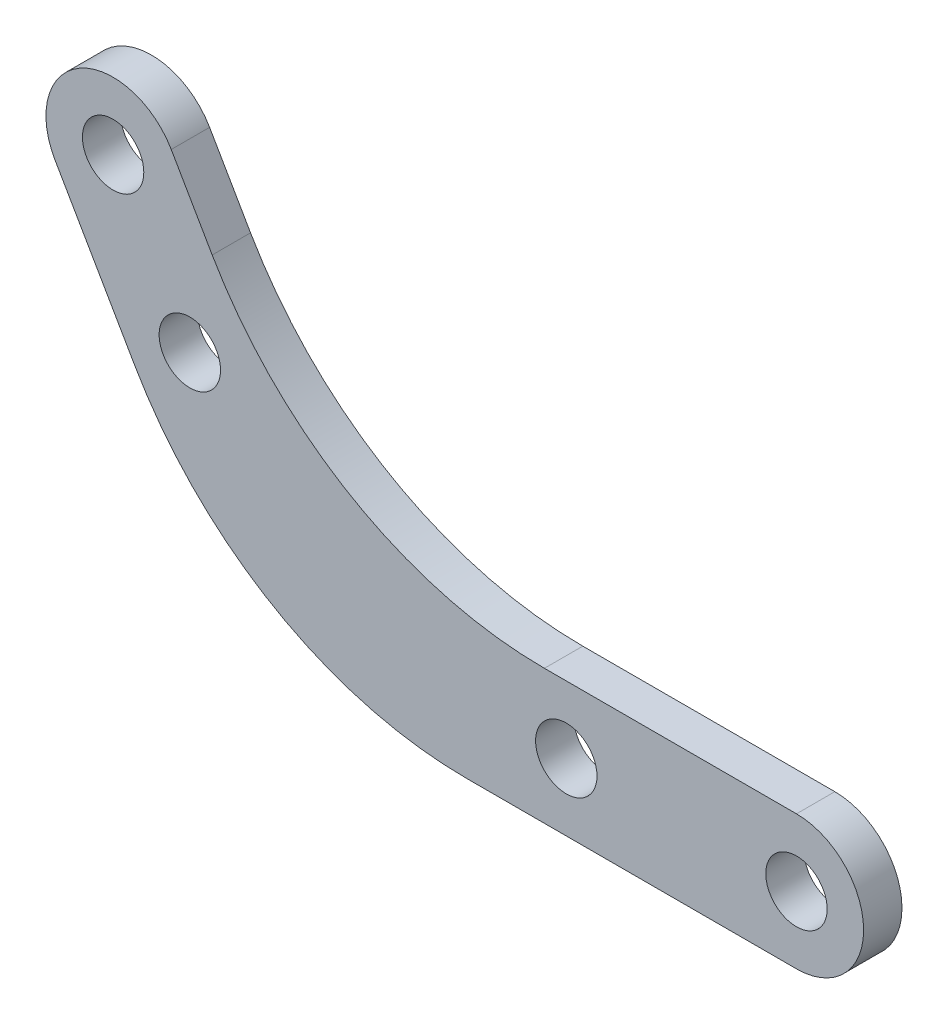
ISO-10303-21;
HEADER;
FILE_DESCRIPTION(('STEP AP214'),'2;1');
FILE_NAME('part.step','',(''),(''),'','','');
FILE_SCHEMA(('AUTOMOTIVE_DESIGN { 1 0 10303 214 1 1 1 1 }'));
ENDSEC;
DATA;
#1=APPLICATION_CONTEXT('core data for automotive mechanical design processes');
#2=APPLICATION_PROTOCOL_DEFINITION('international standard','automotive_design',2000,#1);
#3=PRODUCT_CONTEXT('',#1,'mechanical');
#4=PRODUCT('Part','Part','',(#3));
#5=PRODUCT_RELATED_PRODUCT_CATEGORY('part','',(#4));
#6=PRODUCT_DEFINITION_FORMATION('','',#4);
#7=PRODUCT_DEFINITION_CONTEXT('part definition',#1,'design');
#8=PRODUCT_DEFINITION('design','',#6,#7);
#9=PRODUCT_DEFINITION_SHAPE('','',#8);
#10=(LENGTH_UNIT() NAMED_UNIT(*) SI_UNIT(.MILLI.,.METRE.));
#11=(NAMED_UNIT(*) PLANE_ANGLE_UNIT() SI_UNIT($,.RADIAN.));
#12=(NAMED_UNIT(*) SI_UNIT($,.STERADIAN.) SOLID_ANGLE_UNIT());
#13=UNCERTAINTY_MEASURE_WITH_UNIT(LENGTH_MEASURE(1.E-05),#10,'distance_accuracy_value','');
#14=(GEOMETRIC_REPRESENTATION_CONTEXT(3) GLOBAL_UNCERTAINTY_ASSIGNED_CONTEXT((#13)) GLOBAL_UNIT_ASSIGNED_CONTEXT((#10,
#11,#12)) REPRESENTATION_CONTEXT('',''));
#15=CARTESIAN_POINT('',(0.,0.,0.));
#16=DIRECTION('',(0.,0.,1.));
#17=DIRECTION('',(1.,0.,0.));
#18=AXIS2_PLACEMENT_3D('',#15,#16,#17);
#19=CARTESIAN_POINT('',(87.0000000000003,35.,2.));
#20=DIRECTION('',(0.,0.,-1.));
#21=DIRECTION('',(-1.,0.,0.));
#22=AXIS2_PLACEMENT_3D('',#19,#20,#21);
#23=CYLINDRICAL_SURFACE('',#22,3.5);
#24=CARTESIAN_POINT('',(87.0000000000003,35.,0.));
#25=DIRECTION('',(0.,0.,1.));
#26=DIRECTION('',(1.,0.,0.));
#27=AXIS2_PLACEMENT_3D('',#24,#25,#26);
#28=CIRCLE('',#27,3.5);
#29=CARTESIAN_POINT('',(87.0000000000009,38.5,0.));
#30=VERTEX_POINT('',#29);
#31=CARTESIAN_POINT('',(87.0000000000003,31.5,0.));
#32=VERTEX_POINT('',#31);
#33=EDGE_CURVE('E119',#30,#32,#28,.F.);
#34=ORIENTED_EDGE('',*,*,#33,.F.);
#35=DIRECTION('',(0.,0.,-1.));
#36=VECTOR('',#35,1.);
#37=CARTESIAN_POINT('',(87.0000000000009,38.5,2.));
#38=LINE('',#37,#36);
#39=CARTESIAN_POINT('',(87.0000000000009,38.5,2.));
#40=VERTEX_POINT('',#39);
#41=EDGE_CURVE('E105',#40,#30,#38,.T.);
#42=ORIENTED_EDGE('',*,*,#41,.F.);
#43=CARTESIAN_POINT('',(87.0000000000003,35.,2.));
#44=DIRECTION('',(0.,0.,1.));
#45=DIRECTION('',(1.,0.,0.));
#46=AXIS2_PLACEMENT_3D('',#43,#44,#45);
#47=CIRCLE('',#46,3.5);
#48=CARTESIAN_POINT('',(87.0000000000003,31.5,2.));
#49=VERTEX_POINT('',#48);
#50=EDGE_CURVE('E113',#40,#49,#47,.F.);
#51=ORIENTED_EDGE('',*,*,#50,.T.);
#52=DIRECTION('',(0.,0.,-1.));
#53=VECTOR('',#52,1.);
#54=CARTESIAN_POINT('',(87.0000000000003,31.5,2.));
#55=LINE('',#54,#53);
#56=EDGE_CURVE('E154',#49,#32,#55,.T.);
#57=ORIENTED_EDGE('',*,*,#56,.T.);
#58=EDGE_LOOP('',(#34,#42,#51,#57));
#59=FACE_BOUND('',#58,.T.);
#60=ADVANCED_FACE('F35',(#59),#23,.T.);
#61=CARTESIAN_POINT('',(0.,38.5,2.));
#62=DIRECTION('',(0.,1.,0.));
#63=DIRECTION('',(0.,0.,1.));
#64=AXIS2_PLACEMENT_3D('',#61,#62,#63);
#65=PLANE('',#64);
#66=DIRECTION('',(1.,0.,0.));
#67=VECTOR('',#66,1.);
#68=CARTESIAN_POINT('',(0.,38.5,0.));
#69=LINE('',#68,#67);
#70=CARTESIAN_POINT('',(73.8604719043208,38.5,0.));
#71=VERTEX_POINT('',#70);
#72=EDGE_CURVE('E156',#71,#30,#69,.T.);
#73=ORIENTED_EDGE('',*,*,#72,.F.);
#74=DIRECTION('',(0.,0.,-1.));
#75=VECTOR('',#74,1.);
#76=CARTESIAN_POINT('',(73.8604719043208,38.5,2.));
#77=LINE('',#76,#75);
#78=CARTESIAN_POINT('',(73.8604719043208,38.5,2.));
#79=VERTEX_POINT('',#78);
#80=EDGE_CURVE('E108',#71,#79,#77,.F.);
#81=ORIENTED_EDGE('',*,*,#80,.T.);
#82=DIRECTION('',(1.,0.,0.));
#83=VECTOR('',#82,1.);
#84=CARTESIAN_POINT('',(0.,38.5,2.));
#85=LINE('',#84,#83);
#86=EDGE_CURVE('E101',#79,#40,#85,.T.);
#87=ORIENTED_EDGE('',*,*,#86,.T.);
#88=ORIENTED_EDGE('',*,*,#41,.T.);
#89=EDGE_LOOP('',(#73,#81,#87,#88));
#90=FACE_BOUND('',#89,.T.);
#91=ADVANCED_FACE('F104',(#90),#65,.T.);
#92=CARTESIAN_POINT('',(63.406088913246,36.6075225023261,2.));
#93=DIRECTION('',(0.866025403784426,0.500000000000023,0.));
#94=DIRECTION('',(-0.500000000000023,0.866025403784426,0.));
#95=AXIS2_PLACEMENT_3D('',#92,#93,#94);
#96=PLANE('',#95);
#97=DIRECTION('',(0.500000000000023,-0.866025403784426,0.));
#98=VECTOR('',#97,1.);
#99=CARTESIAN_POINT('',(63.406088913246,36.6075225023261,2.));
#100=LINE('',#99,#98);
#101=CARTESIAN_POINT('',(54.4060889132469,52.1959797704435,2.));
#102=VERTEX_POINT('',#101);
#103=CARTESIAN_POINT('',(56.5399638286323,48.4999999999995,2.));
#104=VERTEX_POINT('',#103);
#105=EDGE_CURVE('E112',#102,#104,#100,.T.);
#106=ORIENTED_EDGE('',*,*,#105,.T.);
#107=DIRECTION('',(0.,0.,-1.));
#108=VECTOR('',#107,1.);
#109=CARTESIAN_POINT('',(56.5399638286323,48.4999999999995,0.));
#110=LINE('',#109,#108);
#111=CARTESIAN_POINT('',(56.5399638286323,48.4999999999995,0.));
#112=VERTEX_POINT('',#111);
#113=EDGE_CURVE('E120',#104,#112,#110,.T.);
#114=ORIENTED_EDGE('',*,*,#113,.T.);
#115=DIRECTION('',(0.500000000000023,-0.866025403784426,0.));
#116=VECTOR('',#115,1.);
#117=CARTESIAN_POINT('',(63.406088913246,36.6075225023261,0.));
#118=LINE('',#117,#116);
#119=CARTESIAN_POINT('',(54.4060889132469,52.1959797704435,0.));
#120=VERTEX_POINT('',#119);
#121=EDGE_CURVE('E158',#120,#112,#118,.T.);
#122=ORIENTED_EDGE('',*,*,#121,.F.);
#123=DIRECTION('',(0.,0.,-1.));
#124=VECTOR('',#123,1.);
#125=CARTESIAN_POINT('',(54.4060889132469,52.1959797704435,2.));
#126=LINE('',#125,#124);
#127=EDGE_CURVE('E121',#102,#120,#126,.T.);
#128=ORIENTED_EDGE('',*,*,#127,.F.);
#129=EDGE_LOOP('',(#106,#114,#122,#128));
#130=FACE_BOUND('',#129,.T.);
#131=ADVANCED_FACE('F198',(#130),#96,.T.);
#132=CARTESIAN_POINT('',(51.3750000000025,50.4459797704442,2.));
#133=DIRECTION('',(0.,0.,-1.));
#134=DIRECTION('',(-1.,0.,0.));
#135=AXIS2_PLACEMENT_3D('',#132,#133,#134);
#136=CYLINDRICAL_SURFACE('',#135,3.49999999999894);
#137=CARTESIAN_POINT('',(51.3750000000025,50.4459797704442,0.));
#138=DIRECTION('',(0.,0.,1.));
#139=DIRECTION('',(1.,0.,0.));
#140=AXIS2_PLACEMENT_3D('',#137,#138,#139);
#141=CIRCLE('',#140,3.49999999999894);
#142=CARTESIAN_POINT('',(48.3439110867577,48.6959797704446,0.));
#143=VERTEX_POINT('',#142);
#144=EDGE_CURVE('E161',#143,#120,#141,.F.);
#145=ORIENTED_EDGE('',*,*,#144,.F.);
#146=DIRECTION('',(0.,0.,-1.));
#147=VECTOR('',#146,1.);
#148=CARTESIAN_POINT('',(48.3439110867577,48.6959797704446,2.));
#149=LINE('',#148,#147);
#150=CARTESIAN_POINT('',(48.3439110867577,48.6959797704446,2.));
#151=VERTEX_POINT('',#150);
#152=EDGE_CURVE('E177',#151,#143,#149,.T.);
#153=ORIENTED_EDGE('',*,*,#152,.F.);
#154=CARTESIAN_POINT('',(51.3750000000025,50.4459797704442,2.));
#155=DIRECTION('',(0.,0.,1.));
#156=DIRECTION('',(1.,0.,0.));
#157=AXIS2_PLACEMENT_3D('',#154,#155,#156);
#158=CIRCLE('',#157,3.49999999999894);
#159=EDGE_CURVE('E136',#151,#102,#158,.F.);
#160=ORIENTED_EDGE('',*,*,#159,.T.);
#161=ORIENTED_EDGE('',*,*,#127,.T.);
#162=EDGE_LOOP('',(#145,#153,#160,#161));
#163=FACE_BOUND('',#162,.T.);
#164=ADVANCED_FACE('F201',(#163),#136,.T.);
#165=CARTESIAN_POINT('',(57.3439110867574,33.1075225023251,2.));
#166=DIRECTION('',(0.86602540378444,0.499999999999998,0.));
#167=DIRECTION('',(-0.499999999999998,0.86602540378444,0.));
#168=AXIS2_PLACEMENT_3D('',#165,#166,#167);
#169=PLANE('',#168);
#170=DIRECTION('',(0.499999999999998,-0.86602540378444,0.));
#171=VECTOR('',#170,1.);
#172=CARTESIAN_POINT('',(57.3439110867574,33.1075225023251,0.));
#173=LINE('',#172,#171);
#174=CARTESIAN_POINT('',(52.4985119443069,41.5,0.));
#175=VERTEX_POINT('',#174);
#176=EDGE_CURVE('E164',#143,#175,#173,.T.);
#177=ORIENTED_EDGE('',*,*,#176,.T.);
#178=DIRECTION('',(0.,0.,-1.));
#179=VECTOR('',#178,1.);
#180=CARTESIAN_POINT('',(52.4985119443069,41.5,2.));
#181=LINE('',#180,#179);
#182=CARTESIAN_POINT('',(52.4985119443069,41.5,2.));
#183=VERTEX_POINT('',#182);
#184=EDGE_CURVE('E50',#175,#183,#181,.F.);
#185=ORIENTED_EDGE('',*,*,#184,.T.);
#186=DIRECTION('',(0.499999999999998,-0.86602540378444,0.));
#187=VECTOR('',#186,1.);
#188=CARTESIAN_POINT('',(57.3439110867574,33.1075225023251,2.));
#189=LINE('',#188,#187);
#190=EDGE_CURVE('E139',#151,#183,#189,.T.);
#191=ORIENTED_EDGE('',*,*,#190,.F.);
#192=ORIENTED_EDGE('',*,*,#152,.T.);
#193=EDGE_LOOP('',(#177,#185,#191,#192));
#194=FACE_BOUND('',#193,.T.);
#195=ADVANCED_FACE('F242',(#194),#169,.F.);
#196=CARTESIAN_POINT('',(55.3750000000025,43.5177765401686,2.));
#197=DIRECTION('',(0.,0.,-1.));
#198=DIRECTION('',(-1.,0.,0.));
#199=AXIS2_PLACEMENT_3D('',#196,#197,#198);
#200=CYLINDRICAL_SURFACE('',#199,1.59999999999956);
#201=CARTESIAN_POINT('',(55.3750000000025,43.5177765401686,2.));
#202=DIRECTION('',(0.,0.,1.));
#203=DIRECTION('',(1.,0.,0.));
#204=AXIS2_PLACEMENT_3D('',#201,#202,#203);
#205=CIRCLE('',#204,1.59999999999956);
#206=CARTESIAN_POINT('',(56.975000000002,43.5177765401686,2.));
#207=VERTEX_POINT('',#206);
#208=EDGE_CURVE('E148',#207,#207,#205,.T.);
#209=ORIENTED_EDGE('',*,*,#208,.T.);
#210=EDGE_LOOP('',(#209));
#211=FACE_BOUND('',#210,.T.);
#212=CARTESIAN_POINT('',(55.3750000000025,43.5177765401686,0.));
#213=DIRECTION('',(0.,0.,1.));
#214=DIRECTION('',(1.,0.,0.));
#215=AXIS2_PLACEMENT_3D('',#212,#213,#214);
#216=CIRCLE('',#215,1.59999999999956);
#217=CARTESIAN_POINT('',(56.975000000002,43.5177765401686,0.));
#218=VERTEX_POINT('',#217);
#219=EDGE_CURVE('E131',#218,#218,#216,.T.);
#220=ORIENTED_EDGE('',*,*,#219,.F.);
#221=EDGE_LOOP('',(#220));
#222=FACE_BOUND('',#221,.T.);
#223=ADVANCED_FACE('F239',(#211,#222),#200,.F.);
#224=CARTESIAN_POINT('',(75.0000000000014,35.,2.));
#225=DIRECTION('',(0.,0.,-1.));
#226=DIRECTION('',(-1.,0.,0.));
#227=AXIS2_PLACEMENT_3D('',#224,#225,#226);
#228=CYLINDRICAL_SURFACE('',#227,1.60000000000001);
#229=CARTESIAN_POINT('',(75.0000000000014,35.,2.));
#230=DIRECTION('',(0.,0.,1.));
#231=DIRECTION('',(1.,0.,0.));
#232=AXIS2_PLACEMENT_3D('',#229,#230,#231);
#233=CIRCLE('',#232,1.60000000000001);
#234=CARTESIAN_POINT('',(76.6000000000014,35.,2.));
#235=VERTEX_POINT('',#234);
#236=EDGE_CURVE('E145',#235,#235,#233,.T.);
#237=ORIENTED_EDGE('',*,*,#236,.T.);
#238=EDGE_LOOP('',(#237));
#239=FACE_BOUND('',#238,.T.);
#240=CARTESIAN_POINT('',(75.0000000000014,35.,0.));
#241=DIRECTION('',(0.,0.,1.));
#242=DIRECTION('',(1.,0.,0.));
#243=AXIS2_PLACEMENT_3D('',#240,#241,#242);
#244=CIRCLE('',#243,1.60000000000001);
#245=CARTESIAN_POINT('',(76.6000000000014,35.,0.));
#246=VERTEX_POINT('',#245);
#247=EDGE_CURVE('E171',#246,#246,#244,.T.);
#248=ORIENTED_EDGE('',*,*,#247,.F.);
#249=EDGE_LOOP('',(#248));
#250=FACE_BOUND('',#249,.T.);
#251=ADVANCED_FACE('F217',(#239,#250),#228,.F.);
#252=CARTESIAN_POINT('',(87.0000000000003,35.,2.));
#253=DIRECTION('',(0.,0.,-1.));
#254=DIRECTION('',(-1.,0.,0.));
#255=AXIS2_PLACEMENT_3D('',#252,#253,#254);
#256=CYLINDRICAL_SURFACE('',#255,1.60000000000001);
#257=CARTESIAN_POINT('',(87.0000000000003,35.,2.));
#258=DIRECTION('',(0.,0.,1.));
#259=DIRECTION('',(1.,0.,0.));
#260=AXIS2_PLACEMENT_3D('',#257,#258,#259);
#261=CIRCLE('',#260,1.60000000000001);
#262=CARTESIAN_POINT('',(88.6000000000003,35.,2.));
#263=VERTEX_POINT('',#262);
#264=EDGE_CURVE('E142',#263,#263,#261,.T.);
#265=ORIENTED_EDGE('',*,*,#264,.T.);
#266=EDGE_LOOP('',(#265));
#267=FACE_BOUND('',#266,.T.);
#268=CARTESIAN_POINT('',(87.0000000000003,35.,0.));
#269=DIRECTION('',(0.,0.,1.));
#270=DIRECTION('',(1.,0.,0.));
#271=AXIS2_PLACEMENT_3D('',#268,#269,#270);
#272=CIRCLE('',#271,1.60000000000001);
#273=CARTESIAN_POINT('',(88.6000000000003,35.,0.));
#274=VERTEX_POINT('',#273);
#275=EDGE_CURVE('E168',#274,#274,#272,.T.);
#276=ORIENTED_EDGE('',*,*,#275,.F.);
#277=EDGE_LOOP('',(#276));
#278=FACE_BOUND('',#277,.T.);
#279=ADVANCED_FACE('F209',(#267,#278),#256,.F.);
#280=CARTESIAN_POINT('',(0.,31.5,2.));
#281=DIRECTION('',(0.,1.,0.));
#282=DIRECTION('',(0.,0.,1.));
#283=AXIS2_PLACEMENT_3D('',#280,#281,#282);
#284=PLANE('',#283);
#285=DIRECTION('',(1.,0.,0.));
#286=VECTOR('',#285,1.);
#287=CARTESIAN_POINT('',(0.,31.5,2.));
#288=LINE('',#287,#286);
#289=CARTESIAN_POINT('',(69.8190200199957,31.5,2.));
#290=VERTEX_POINT('',#289);
#291=EDGE_CURVE('E126',#290,#49,#288,.T.);
#292=ORIENTED_EDGE('',*,*,#291,.F.);
#293=DIRECTION('',(0.,0.,-1.));
#294=VECTOR('',#293,1.);
#295=CARTESIAN_POINT('',(69.8190200199957,31.5,2.));
#296=LINE('',#295,#294);
#297=CARTESIAN_POINT('',(69.8190200199957,31.5,0.));
#298=VERTEX_POINT('',#297);
#299=EDGE_CURVE('E183',#290,#298,#296,.T.);
#300=ORIENTED_EDGE('',*,*,#299,.T.);
#301=DIRECTION('',(1.,0.,0.));
#302=VECTOR('',#301,1.);
#303=CARTESIAN_POINT('',(0.,31.5,0.));
#304=LINE('',#303,#302);
#305=EDGE_CURVE('E166',#298,#32,#304,.T.);
#306=ORIENTED_EDGE('',*,*,#305,.T.);
#307=ORIENTED_EDGE('',*,*,#56,.F.);
#308=EDGE_LOOP('',(#292,#300,#306,#307));
#309=FACE_BOUND('',#308,.T.);
#310=ADVANCED_FACE('F206',(#309),#284,.F.);
#311=CARTESIAN_POINT('',(51.3750000000025,50.4459797704442,2.));
#312=DIRECTION('',(0.,0.,-1.));
#313=DIRECTION('',(-1.,0.,0.));
#314=AXIS2_PLACEMENT_3D('',#311,#312,#313);
#315=CYLINDRICAL_SURFACE('',#314,1.59999999999956);
#316=CARTESIAN_POINT('',(51.3750000000025,50.4459797704442,2.));
#317=DIRECTION('',(0.,0.,1.));
#318=DIRECTION('',(1.,0.,0.));
#319=AXIS2_PLACEMENT_3D('',#316,#317,#318);
#320=CIRCLE('',#319,1.59999999999956);
#321=CARTESIAN_POINT('',(52.975000000002,50.4459797704442,2.));
#322=VERTEX_POINT('',#321);
#323=EDGE_CURVE('E151',#322,#322,#320,.T.);
#324=ORIENTED_EDGE('',*,*,#323,.T.);
#325=EDGE_LOOP('',(#324));
#326=FACE_BOUND('',#325,.T.);
#327=CARTESIAN_POINT('',(51.3750000000025,50.4459797704442,0.));
#328=DIRECTION('',(0.,0.,1.));
#329=DIRECTION('',(1.,0.,0.));
#330=AXIS2_PLACEMENT_3D('',#327,#328,#329);
#331=CIRCLE('',#330,1.59999999999956);
#332=CARTESIAN_POINT('',(52.975000000002,50.4459797704442,0.));
#333=VERTEX_POINT('',#332);
#334=EDGE_CURVE('E128',#333,#333,#331,.T.);
#335=ORIENTED_EDGE('',*,*,#334,.F.);
#336=EDGE_LOOP('',(#335));
#337=FACE_BOUND('',#336,.T.);
#338=ADVANCED_FACE('F208',(#326,#337),#315,.F.);
#339=CARTESIAN_POINT('',(0.,0.,2.));
#340=DIRECTION('',(0.,0.,1.));
#341=DIRECTION('',(1.,0.,0.));
#342=AXIS2_PLACEMENT_3D('',#339,#340,#341);
#343=PLANE('',#342);
#344=ORIENTED_EDGE('',*,*,#190,.T.);
#345=CARTESIAN_POINT('',(69.8190200199957,51.5,2.));
#346=DIRECTION('',(0.,0.,1.));
#347=DIRECTION('',(1.,0.,0.));
#348=AXIS2_PLACEMENT_3D('',#345,#346,#347);
#349=CIRCLE('',#348,20.);
#350=EDGE_CURVE('E188',#183,#290,#349,.T.);
#351=ORIENTED_EDGE('',*,*,#350,.T.);
#352=ORIENTED_EDGE('',*,*,#291,.T.);
#353=ORIENTED_EDGE('',*,*,#50,.F.);
#354=ORIENTED_EDGE('',*,*,#86,.F.);
#355=CARTESIAN_POINT('',(73.8604719043208,58.5,2.));
#356=DIRECTION('',(0.,0.,1.));
#357=DIRECTION('',(1.,0.,0.));
#358=AXIS2_PLACEMENT_3D('',#355,#356,#357);
#359=CIRCLE('',#358,20.);
#360=EDGE_CURVE('E11',#79,#104,#359,.F.);
#361=ORIENTED_EDGE('',*,*,#360,.T.);
#362=ORIENTED_EDGE('',*,*,#105,.F.);
#363=ORIENTED_EDGE('',*,*,#159,.F.);
#364=EDGE_LOOP('',(#344,#351,#352,#353,#354,#361,#362,#363));
#365=FACE_BOUND('',#364,.T.);
#366=ORIENTED_EDGE('',*,*,#264,.F.);
#367=EDGE_LOOP('',(#366));
#368=FACE_BOUND('',#367,.T.);
#369=ORIENTED_EDGE('',*,*,#236,.F.);
#370=EDGE_LOOP('',(#369));
#371=FACE_BOUND('',#370,.T.);
#372=ORIENTED_EDGE('',*,*,#208,.F.);
#373=EDGE_LOOP('',(#372));
#374=FACE_BOUND('',#373,.T.);
#375=ORIENTED_EDGE('',*,*,#323,.F.);
#376=EDGE_LOOP('',(#375));
#377=FACE_BOUND('',#376,.T.);
#378=ADVANCED_FACE('F123',(#365,#368,#371,#374,#377),#343,.T.);
#379=CARTESIAN_POINT('',(0.,0.,0.));
#380=DIRECTION('',(0.,0.,1.));
#381=DIRECTION('',(1.,0.,0.));
#382=AXIS2_PLACEMENT_3D('',#379,#380,#381);
#383=PLANE('',#382);
#384=ORIENTED_EDGE('',*,*,#305,.F.);
#385=CARTESIAN_POINT('',(69.8190200199957,51.5,0.));
#386=DIRECTION('',(0.,0.,1.));
#387=DIRECTION('',(1.,0.,0.));
#388=AXIS2_PLACEMENT_3D('',#385,#386,#387);
#389=CIRCLE('',#388,20.);
#390=EDGE_CURVE('E58',#298,#175,#389,.F.);
#391=ORIENTED_EDGE('',*,*,#390,.T.);
#392=ORIENTED_EDGE('',*,*,#176,.F.);
#393=ORIENTED_EDGE('',*,*,#144,.T.);
#394=ORIENTED_EDGE('',*,*,#121,.T.);
#395=CARTESIAN_POINT('',(73.8604719043208,58.5,0.));
#396=DIRECTION('',(0.,0.,1.));
#397=DIRECTION('',(1.,0.,0.));
#398=AXIS2_PLACEMENT_3D('',#395,#396,#397);
#399=CIRCLE('',#398,20.);
#400=EDGE_CURVE('E43',#112,#71,#399,.T.);
#401=ORIENTED_EDGE('',*,*,#400,.T.);
#402=ORIENTED_EDGE('',*,*,#72,.T.);
#403=ORIENTED_EDGE('',*,*,#33,.T.);
#404=EDGE_LOOP('',(#384,#391,#392,#393,#394,#401,#402,#403));
#405=FACE_BOUND('',#404,.T.);
#406=ORIENTED_EDGE('',*,*,#275,.T.);
#407=EDGE_LOOP('',(#406));
#408=FACE_BOUND('',#407,.T.);
#409=ORIENTED_EDGE('',*,*,#247,.T.);
#410=EDGE_LOOP('',(#409));
#411=FACE_BOUND('',#410,.T.);
#412=ORIENTED_EDGE('',*,*,#219,.T.);
#413=EDGE_LOOP('',(#412));
#414=FACE_BOUND('',#413,.T.);
#415=ORIENTED_EDGE('',*,*,#334,.T.);
#416=EDGE_LOOP('',(#415));
#417=FACE_BOUND('',#416,.T.);
#418=ADVANCED_FACE('F189',(#405,#408,#411,#414,#417),#383,.F.);
#419=CARTESIAN_POINT('',(73.8604719043208,58.5,2.));
#420=DIRECTION('',(0.,0.,1.));
#421=DIRECTION('',(1.,0.,0.));
#422=AXIS2_PLACEMENT_3D('',#419,#420,#421);
#423=CYLINDRICAL_SURFACE('',#422,20.);
#424=ORIENTED_EDGE('',*,*,#360,.F.);
#425=ORIENTED_EDGE('',*,*,#80,.F.);
#426=ORIENTED_EDGE('',*,*,#400,.F.);
#427=ORIENTED_EDGE('',*,*,#113,.F.);
#428=EDGE_LOOP('',(#424,#425,#426,#427));
#429=FACE_BOUND('',#428,.T.);
#430=ADVANCED_FACE('F194',(#429),#423,.F.);
#431=CARTESIAN_POINT('',(69.8190200199957,51.5,2.));
#432=DIRECTION('',(0.,0.,-1.));
#433=DIRECTION('',(-1.,0.,0.));
#434=AXIS2_PLACEMENT_3D('',#431,#432,#433);
#435=CYLINDRICAL_SURFACE('',#434,20.);
#436=ORIENTED_EDGE('',*,*,#350,.F.);
#437=ORIENTED_EDGE('',*,*,#184,.F.);
#438=ORIENTED_EDGE('',*,*,#390,.F.);
#439=ORIENTED_EDGE('',*,*,#299,.F.);
#440=EDGE_LOOP('',(#436,#437,#438,#439));
#441=FACE_BOUND('',#440,.T.);
#442=ADVANCED_FACE('F37',(#441),#435,.T.);
#443=CLOSED_SHELL('',(#60,#91,#131,#164,#195,#223,#251,#279,#310,#338,#378,#418,#430,#442));
#444=MANIFOLD_SOLID_BREP('B2',#443);
#445=ADVANCED_BREP_SHAPE_REPRESENTATION('',(#18,#444),#14);
#446=SHAPE_DEFINITION_REPRESENTATION(#9,#445);
ENDSEC;
END-ISO-10303-21;
